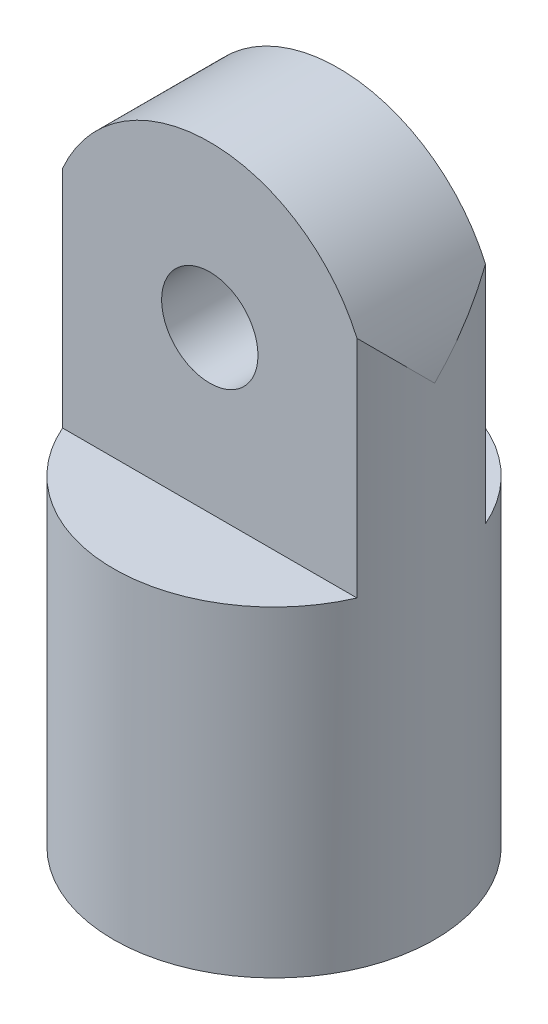
ISO-10303-21;
HEADER;
FILE_DESCRIPTION(('STEP AP214'),'2;1');
FILE_NAME('part.step','',(''),(''),'','','');
FILE_SCHEMA(('AUTOMOTIVE_DESIGN { 1 0 10303 214 1 1 1 1 }'));
ENDSEC;
DATA;
#1=APPLICATION_CONTEXT('core data for automotive mechanical design processes');
#2=APPLICATION_PROTOCOL_DEFINITION('international standard','automotive_design',2000,#1);
#3=PRODUCT_CONTEXT('',#1,'mechanical');
#4=PRODUCT('Part','Part','',(#3));
#5=PRODUCT_RELATED_PRODUCT_CATEGORY('part','',(#4));
#6=PRODUCT_DEFINITION_FORMATION('','',#4);
#7=PRODUCT_DEFINITION_CONTEXT('part definition',#1,'design');
#8=PRODUCT_DEFINITION('design','',#6,#7);
#9=PRODUCT_DEFINITION_SHAPE('','',#8);
#10=(LENGTH_UNIT() NAMED_UNIT(*) SI_UNIT(.MILLI.,.METRE.));
#11=(NAMED_UNIT(*) PLANE_ANGLE_UNIT() SI_UNIT($,.RADIAN.));
#12=(NAMED_UNIT(*) SI_UNIT($,.STERADIAN.) SOLID_ANGLE_UNIT());
#13=UNCERTAINTY_MEASURE_WITH_UNIT(LENGTH_MEASURE(1.E-05),#10,'distance_accuracy_value','');
#14=(GEOMETRIC_REPRESENTATION_CONTEXT(3) GLOBAL_UNCERTAINTY_ASSIGNED_CONTEXT((#13)) GLOBAL_UNIT_ASSIGNED_CONTEXT((#10,
#11,#12)) REPRESENTATION_CONTEXT('',''));
#15=CARTESIAN_POINT('',(0.,0.,0.));
#16=DIRECTION('',(0.,0.,1.));
#17=DIRECTION('',(1.,0.,0.));
#18=AXIS2_PLACEMENT_3D('',#15,#16,#17);
#19=CARTESIAN_POINT('',(0.,200.,0.));
#20=DIRECTION('',(0.,-1.,0.));
#21=DIRECTION('',(0.,0.,-1.));
#22=AXIS2_PLACEMENT_3D('',#19,#20,#21);
#23=CYLINDRICAL_SURFACE('',#22,50.);
#24=CARTESIAN_POINT('',(0.,0.,0.));
#25=DIRECTION('',(0.,1.,0.));
#26=DIRECTION('',(0.,0.,1.));
#27=AXIS2_PLACEMENT_3D('',#24,#25,#26);
#28=CIRCLE('',#27,50.);
#29=CARTESIAN_POINT('',(0.,0.,50.));
#30=VERTEX_POINT('',#29);
#31=EDGE_CURVE('E131',#30,#30,#28,.T.);
#32=ORIENTED_EDGE('',*,*,#31,.T.);
#33=EDGE_LOOP('',(#32));
#34=FACE_BOUND('',#33,.T.);
#35=CARTESIAN_POINT('',(0.,150.,0.));
#36=DIRECTION('',(0.,-0.707106781186547,-0.707106781186547));
#37=DIRECTION('',(0.,-0.707106781186547,0.707106781186547));
#38=AXIS2_PLACEMENT_3D('',#35,#36,#37);
#39=ELLIPSE('',#38,70.7106781186548,50.);
#40=CARTESIAN_POINT('',(-45.8257569495584,170.,-20.));
#41=VERTEX_POINT('',#40);
#42=CARTESIAN_POINT('',(-50.,150.,0.));
#43=VERTEX_POINT('',#42);
#44=EDGE_CURVE('E91',#41,#43,#39,.F.);
#45=ORIENTED_EDGE('',*,*,#44,.F.);
#46=DIRECTION('',(0.,-1.,0.));
#47=VECTOR('',#46,1.);
#48=CARTESIAN_POINT('',(-45.8257569495584,200.,-20.));
#49=LINE('',#48,#47);
#50=CARTESIAN_POINT('',(-45.8257569495584,100.,-20.));
#51=VERTEX_POINT('',#50);
#52=EDGE_CURVE('E119',#51,#41,#49,.F.);
#53=ORIENTED_EDGE('',*,*,#52,.F.);
#54=CARTESIAN_POINT('',(0.,100.,0.));
#55=DIRECTION('',(0.,1.,0.));
#56=DIRECTION('',(0.,0.,1.));
#57=AXIS2_PLACEMENT_3D('',#54,#55,#56);
#58=CIRCLE('',#57,50.);
#59=CARTESIAN_POINT('',(45.8257569495584,100.,-20.));
#60=VERTEX_POINT('',#59);
#61=EDGE_CURVE('E135',#60,#51,#58,.T.);
#62=ORIENTED_EDGE('',*,*,#61,.F.);
#63=DIRECTION('',(0.,-1.,0.));
#64=VECTOR('',#63,1.);
#65=CARTESIAN_POINT('',(45.8257569495584,200.,-20.));
#66=LINE('',#65,#64);
#67=CARTESIAN_POINT('',(45.8257569495584,170.,-20.));
#68=VERTEX_POINT('',#67);
#69=EDGE_CURVE('E122',#68,#60,#66,.T.);
#70=ORIENTED_EDGE('',*,*,#69,.F.);
#71=CARTESIAN_POINT('',(50.,150.,0.));
#72=VERTEX_POINT('',#71);
#73=EDGE_CURVE('E99',#72,#68,#39,.F.);
#74=ORIENTED_EDGE('',*,*,#73,.F.);
#75=CARTESIAN_POINT('',(0.,150.,0.));
#76=DIRECTION('',(0.,-0.707106781186547,0.707106781186547));
#77=DIRECTION('',(0.,-0.707106781186547,-0.707106781186547));
#78=AXIS2_PLACEMENT_3D('',#75,#76,#77);
#79=ELLIPSE('',#78,70.7106781186548,50.);
#80=CARTESIAN_POINT('',(45.8257569495584,170.,20.));
#81=VERTEX_POINT('',#80);
#82=EDGE_CURVE('E103',#81,#72,#79,.F.);
#83=ORIENTED_EDGE('',*,*,#82,.F.);
#84=DIRECTION('',(0.,-1.,0.));
#85=VECTOR('',#84,1.);
#86=CARTESIAN_POINT('',(45.8257569495584,200.,20.));
#87=LINE('',#86,#85);
#88=CARTESIAN_POINT('',(45.8257569495584,100.,20.));
#89=VERTEX_POINT('',#88);
#90=EDGE_CURVE('E125',#89,#81,#87,.F.);
#91=ORIENTED_EDGE('',*,*,#90,.F.);
#92=CARTESIAN_POINT('',(0.,100.,0.));
#93=DIRECTION('',(0.,1.,0.));
#94=DIRECTION('',(0.,0.,1.));
#95=AXIS2_PLACEMENT_3D('',#92,#93,#94);
#96=CIRCLE('',#95,50.);
#97=CARTESIAN_POINT('',(-45.8257569495584,100.,20.));
#98=VERTEX_POINT('',#97);
#99=EDGE_CURVE('E54',#98,#89,#96,.T.);
#100=ORIENTED_EDGE('',*,*,#99,.F.);
#101=DIRECTION('',(0.,-1.,0.));
#102=VECTOR('',#101,1.);
#103=CARTESIAN_POINT('',(-45.8257569495584,200.,20.));
#104=LINE('',#103,#102);
#105=CARTESIAN_POINT('',(-45.8257569495584,170.,20.));
#106=VERTEX_POINT('',#105);
#107=EDGE_CURVE('E67',#106,#98,#104,.T.);
#108=ORIENTED_EDGE('',*,*,#107,.F.);
#109=EDGE_CURVE('E61',#43,#106,#79,.F.);
#110=ORIENTED_EDGE('',*,*,#109,.F.);
#111=EDGE_LOOP('',(#45,#53,#62,#70,#74,#83,#91,#100,#108,#110));
#112=FACE_BOUND('',#111,.T.);
#113=ADVANCED_FACE('F45',(#34,#112),#23,.T.);
#114=CARTESIAN_POINT('',(200.,100.,-20.));
#115=DIRECTION('',(0.,0.,-1.));
#116=DIRECTION('',(-1.,0.,0.));
#117=AXIS2_PLACEMENT_3D('',#114,#115,#116);
#118=PLANE('',#117);
#119=CARTESIAN_POINT('',(0.,150.,-20.));
#120=DIRECTION('',(0.,0.,-1.));
#121=DIRECTION('',(-1.,0.,0.));
#122=AXIS2_PLACEMENT_3D('',#119,#120,#121);
#123=CIRCLE('',#122,15.);
#124=CARTESIAN_POINT('',(-15.,150.,-20.));
#125=VERTEX_POINT('',#124);
#126=EDGE_CURVE('E107',#125,#125,#123,.F.);
#127=ORIENTED_EDGE('',*,*,#126,.T.);
#128=EDGE_LOOP('',(#127));
#129=FACE_BOUND('',#128,.T.);
#130=ORIENTED_EDGE('',*,*,#52,.T.);
#131=CARTESIAN_POINT('',(0.,150.,-20.));
#132=DIRECTION('',(0.,0.,-1.));
#133=DIRECTION('',(-1.,0.,0.));
#134=AXIS2_PLACEMENT_3D('',#131,#132,#133);
#135=CIRCLE('',#134,50.);
#136=EDGE_CURVE('E94',#41,#68,#135,.T.);
#137=ORIENTED_EDGE('',*,*,#136,.T.);
#138=ORIENTED_EDGE('',*,*,#69,.T.);
#139=DIRECTION('',(-1.,0.,0.));
#140=VECTOR('',#139,1.);
#141=CARTESIAN_POINT('',(200.,100.,-20.));
#142=LINE('',#141,#140);
#143=EDGE_CURVE('E112',#60,#51,#142,.T.);
#144=ORIENTED_EDGE('',*,*,#143,.T.);
#145=EDGE_LOOP('',(#130,#137,#138,#144));
#146=FACE_BOUND('',#145,.T.);
#147=ADVANCED_FACE('F149',(#129,#146),#118,.T.);
#148=CARTESIAN_POINT('',(200.,100.,20.));
#149=DIRECTION('',(0.,0.,1.));
#150=DIRECTION('',(1.,0.,0.));
#151=AXIS2_PLACEMENT_3D('',#148,#149,#150);
#152=PLANE('',#151);
#153=CARTESIAN_POINT('',(0.,150.,20.));
#154=DIRECTION('',(0.,0.,1.));
#155=DIRECTION('',(1.,0.,0.));
#156=AXIS2_PLACEMENT_3D('',#153,#154,#155);
#157=CIRCLE('',#156,15.);
#158=CARTESIAN_POINT('',(15.,150.,20.));
#159=VERTEX_POINT('',#158);
#160=EDGE_CURVE('E48',#159,#159,#157,.F.);
#161=ORIENTED_EDGE('',*,*,#160,.T.);
#162=EDGE_LOOP('',(#161));
#163=FACE_BOUND('',#162,.T.);
#164=ORIENTED_EDGE('',*,*,#90,.T.);
#165=CARTESIAN_POINT('',(0.,150.,20.));
#166=DIRECTION('',(0.,0.,1.));
#167=DIRECTION('',(1.,0.,0.));
#168=AXIS2_PLACEMENT_3D('',#165,#166,#167);
#169=CIRCLE('',#168,50.);
#170=EDGE_CURVE('E11',#81,#106,#169,.T.);
#171=ORIENTED_EDGE('',*,*,#170,.T.);
#172=ORIENTED_EDGE('',*,*,#107,.T.);
#173=DIRECTION('',(-1.,0.,0.));
#174=VECTOR('',#173,1.);
#175=CARTESIAN_POINT('',(200.,100.,20.));
#176=LINE('',#175,#174);
#177=EDGE_CURVE('E116',#89,#98,#176,.T.);
#178=ORIENTED_EDGE('',*,*,#177,.F.);
#179=EDGE_LOOP('',(#164,#171,#172,#178));
#180=FACE_BOUND('',#179,.T.);
#181=ADVANCED_FACE('F141',(#163,#180),#152,.T.);
#182=CARTESIAN_POINT('',(0.,0.,0.));
#183=DIRECTION('',(0.,1.,0.));
#184=DIRECTION('',(0.,0.,1.));
#185=AXIS2_PLACEMENT_3D('',#182,#183,#184);
#186=PLANE('',#185);
#187=ORIENTED_EDGE('',*,*,#31,.F.);
#188=EDGE_LOOP('',(#187));
#189=FACE_BOUND('',#188,.T.);
#190=ADVANCED_FACE('F153',(#189),#186,.F.);
#191=CARTESIAN_POINT('',(200.,100.,-20.));
#192=DIRECTION('',(0.,1.,0.));
#193=DIRECTION('',(0.,0.,1.));
#194=AXIS2_PLACEMENT_3D('',#191,#192,#193);
#195=PLANE('',#194);
#196=ORIENTED_EDGE('',*,*,#61,.T.);
#197=ORIENTED_EDGE('',*,*,#143,.F.);
#198=EDGE_LOOP('',(#196,#197));
#199=FACE_BOUND('',#198,.T.);
#200=ADVANCED_FACE('F151',(#199),#195,.T.);
#201=CARTESIAN_POINT('',(200.,100.,70.));
#202=DIRECTION('',(0.,1.,0.));
#203=DIRECTION('',(0.,0.,1.));
#204=AXIS2_PLACEMENT_3D('',#201,#202,#203);
#205=PLANE('',#204);
#206=ORIENTED_EDGE('',*,*,#99,.T.);
#207=ORIENTED_EDGE('',*,*,#177,.T.);
#208=EDGE_LOOP('',(#206,#207));
#209=FACE_BOUND('',#208,.T.);
#210=ADVANCED_FACE('F139',(#209),#205,.T.);
#211=CARTESIAN_POINT('',(0.,150.,220.));
#212=DIRECTION('',(0.,0.,-1.));
#213=DIRECTION('',(-1.,0.,0.));
#214=AXIS2_PLACEMENT_3D('',#211,#212,#213);
#215=CYLINDRICAL_SURFACE('',#214,50.);
#216=ORIENTED_EDGE('',*,*,#170,.F.);
#217=ORIENTED_EDGE('',*,*,#82,.T.);
#218=ORIENTED_EDGE('',*,*,#73,.T.);
#219=ORIENTED_EDGE('',*,*,#136,.F.);
#220=ORIENTED_EDGE('',*,*,#44,.T.);
#221=ORIENTED_EDGE('',*,*,#109,.T.);
#222=EDGE_LOOP('',(#216,#217,#218,#219,#220,#221));
#223=FACE_BOUND('',#222,.T.);
#224=ADVANCED_FACE('F92',(#223),#215,.T.);
#225=CARTESIAN_POINT('',(0.,150.,220.));
#226=DIRECTION('',(0.,0.,-1.));
#227=DIRECTION('',(-1.,0.,0.));
#228=AXIS2_PLACEMENT_3D('',#225,#226,#227);
#229=CYLINDRICAL_SURFACE('',#228,15.);
#230=ORIENTED_EDGE('',*,*,#126,.F.);
#231=EDGE_LOOP('',(#230));
#232=FACE_BOUND('',#231,.T.);
#233=ORIENTED_EDGE('',*,*,#160,.F.);
#234=EDGE_LOOP('',(#233));
#235=FACE_BOUND('',#234,.T.);
#236=ADVANCED_FACE('F180',(#232,#235),#229,.F.);
#237=CLOSED_SHELL('',(#113,#147,#181,#190,#200,#210,#224,#236));
#238=MANIFOLD_SOLID_BREP('B2',#237);
#239=ADVANCED_BREP_SHAPE_REPRESENTATION('',(#18,#238),#14);
#240=SHAPE_DEFINITION_REPRESENTATION(#9,#239);
ENDSEC;
END-ISO-10303-21;
